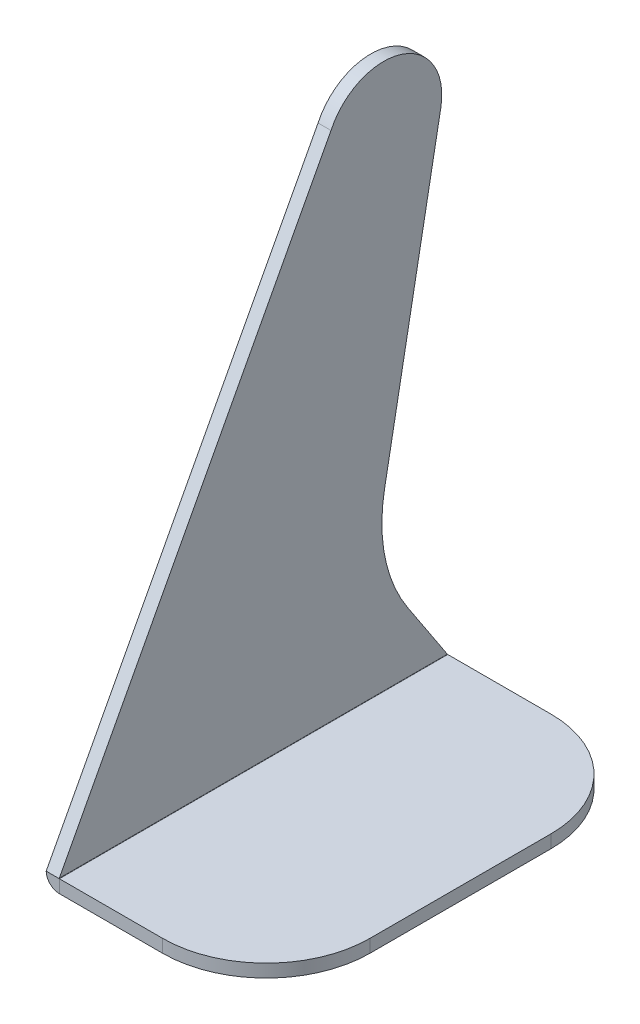
ISO-10303-21;
HEADER;
FILE_DESCRIPTION(('STEP AP214'),'2;1');
FILE_NAME('part.step','',(''),(''),'','','');
FILE_SCHEMA(('AUTOMOTIVE_DESIGN { 1 0 10303 214 1 1 1 1 }'));
ENDSEC;
DATA;
#1=APPLICATION_CONTEXT('core data for automotive mechanical design processes');
#2=APPLICATION_PROTOCOL_DEFINITION('international standard','automotive_design',2000,#1);
#3=PRODUCT_CONTEXT('',#1,'mechanical');
#4=PRODUCT('Part','Part','',(#3));
#5=PRODUCT_RELATED_PRODUCT_CATEGORY('part','',(#4));
#6=PRODUCT_DEFINITION_FORMATION('','',#4);
#7=PRODUCT_DEFINITION_CONTEXT('part definition',#1,'design');
#8=PRODUCT_DEFINITION('design','',#6,#7);
#9=PRODUCT_DEFINITION_SHAPE('','',#8);
#10=(LENGTH_UNIT() NAMED_UNIT(*) SI_UNIT(.MILLI.,.METRE.));
#11=(NAMED_UNIT(*) PLANE_ANGLE_UNIT() SI_UNIT($,.RADIAN.));
#12=(NAMED_UNIT(*) SI_UNIT($,.STERADIAN.) SOLID_ANGLE_UNIT());
#13=UNCERTAINTY_MEASURE_WITH_UNIT(LENGTH_MEASURE(1.E-05),#10,'distance_accuracy_value','');
#14=(GEOMETRIC_REPRESENTATION_CONTEXT(3) GLOBAL_UNCERTAINTY_ASSIGNED_CONTEXT((#13)) GLOBAL_UNIT_ASSIGNED_CONTEXT((#10,
#11,#12)) REPRESENTATION_CONTEXT('',''));
#15=CARTESIAN_POINT('',(0.,0.,0.));
#16=DIRECTION('',(0.,0.,1.));
#17=DIRECTION('',(1.,0.,0.));
#18=AXIS2_PLACEMENT_3D('',#15,#16,#17);
#19=CARTESIAN_POINT('',(-112.412131591498,-100.,-150.));
#20=DIRECTION('',(0.,0.,-1.));
#21=DIRECTION('',(1.,0.,0.));
#22=AXIS2_PLACEMENT_3D('',#19,#20,#21);
#23=PLANE('',#22);
#24=DIRECTION('',(0.,-1.,0.));
#25=VECTOR('',#24,1.);
#26=CARTESIAN_POINT('',(-112.412131591498,-100.,-150.));
#27=LINE('',#26,#25);
#28=CARTESIAN_POINT('',(-112.412131591498,-100.,-150.));
#29=VERTEX_POINT('',#28);
#30=CARTESIAN_POINT('',(-112.412131591498,-105.,-150.));
#31=VERTEX_POINT('',#30);
#32=EDGE_CURVE('E240',#29,#31,#27,.T.);
#33=ORIENTED_EDGE('',*,*,#32,.T.);
#34=CARTESIAN_POINT('',(-112.412131591498,-99.9,-150.));
#35=DIRECTION('',(0.,0.,1.));
#36=DIRECTION('',(1.,0.,0.));
#37=AXIS2_PLACEMENT_3D('',#34,#35,#36);
#38=CIRCLE('',#37,5.1);
#39=CARTESIAN_POINT('',(-117.511151105091,-100.,-150.));
#40=VERTEX_POINT('',#39);
#41=EDGE_CURVE('E210',#40,#31,#38,.T.);
#42=ORIENTED_EDGE('',*,*,#41,.F.);
#43=DIRECTION('',(1.,0.,0.));
#44=VECTOR('',#43,1.);
#45=CARTESIAN_POINT('',(-117.512131591498,-100.,-150.));
#46=LINE('',#45,#44);
#47=EDGE_CURVE('E175',#40,#29,#46,.T.);
#48=ORIENTED_EDGE('',*,*,#47,.T.);
#49=EDGE_LOOP('',(#33,#42,#48));
#50=FACE_BOUND('',#49,.T.);
#51=ADVANCED_FACE('F47',(#50),#23,.T.);
#52=CARTESIAN_POINT('',(-112.412131591498,-99.9,-150.));
#53=DIRECTION('',(0.,0.,1.));
#54=DIRECTION('',(-1.,0.,0.));
#55=AXIS2_PLACEMENT_3D('',#52,#53,#54);
#56=CYLINDRICAL_SURFACE('',#55,0.1);
#57=DIRECTION('',(0.,0.,1.));
#58=VECTOR('',#57,1.);
#59=CARTESIAN_POINT('',(-112.512131591498,-99.9,-150.));
#60=LINE('',#59,#58);
#61=CARTESIAN_POINT('',(-112.512131591498,-99.9,-149.934029584814));
#62=VERTEX_POINT('',#61);
#63=CARTESIAN_POINT('',(-112.512131591498,-99.8999999999999,-0.0531020431389362));
#64=VERTEX_POINT('',#63);
#65=EDGE_CURVE('E225',#62,#64,#60,.T.);
#66=ORIENTED_EDGE('',*,*,#65,.T.);
#67=CARTESIAN_POINT('',(-112.412131591498,-99.9,-0.0531020431389084));
#68=DIRECTION('',(0.,0.468997091214095,0.883199710389852));
#69=DIRECTION('',(0.,-0.883199710389852,0.468997091214095));
#70=AXIS2_PLACEMENT_3D('',#67,#68,#69);
#71=ELLIPSE('',#70,0.113224674808667,0.1);
#72=CARTESIAN_POINT('',(-112.412131591498,-100.,0.));
#73=VERTEX_POINT('',#72);
#74=EDGE_CURVE('E188',#64,#73,#71,.T.);
#75=ORIENTED_EDGE('',*,*,#74,.T.);
#76=DIRECTION('',(0.,0.,1.));
#77=VECTOR('',#76,1.);
#78=CARTESIAN_POINT('',(-112.412131591498,-100.,-150.));
#79=LINE('',#78,#77);
#80=EDGE_CURVE('E228',#29,#73,#79,.T.);
#81=ORIENTED_EDGE('',*,*,#80,.F.);
#82=CARTESIAN_POINT('',(-112.412131591498,-99.9,-149.934029584814));
#83=DIRECTION('',(0.,-0.550670177109292,0.834722921718591));
#84=DIRECTION('',(0.,0.834722921718591,0.550670177109292));
#85=AXIS2_PLACEMENT_3D('',#82,#83,#84);
#86=ELLIPSE('',#85,0.11980023238623,0.1);
#87=EDGE_CURVE('E193',#62,#29,#86,.T.);
#88=ORIENTED_EDGE('',*,*,#87,.F.);
#89=EDGE_LOOP('',(#66,#75,#81,#88));
#90=FACE_BOUND('',#89,.T.);
#91=ADVANCED_FACE('F295',(#90),#56,.F.);
#92=CARTESIAN_POINT('',(-112.512131591498,120.,-150.));
#93=DIRECTION('',(1.,0.,0.));
#94=DIRECTION('',(0.,1.,0.));
#95=AXIS2_PLACEMENT_3D('',#92,#93,#94);
#96=PLANE('',#95);
#97=CARTESIAN_POINT('',(-112.512131591498,-43.5585141976306,-184.645456910847));
#98=DIRECTION('',(-1.,0.,0.));
#99=DIRECTION('',(0.,1.,0.));
#100=AXIS2_PLACEMENT_3D('',#97,#98,#99);
#101=CIRCLE('',#100,60.);
#102=CARTESIAN_POINT('',(-112.512131591498,-32.5634384525264,-125.661490366036));
#103=VERTEX_POINT('',#102);
#104=CARTESIAN_POINT('',(-112.512131591498,-76.5987248241883,-134.562081607732));
#105=VERTEX_POINT('',#104);
#106=EDGE_CURVE('E200',#103,#105,#101,.F.);
#107=ORIENTED_EDGE('',*,*,#106,.F.);
#108=DIRECTION('',(0.,-0.983066109080189,0.183251262418403));
#109=VECTOR('',#108,1.);
#110=CARTESIAN_POINT('',(-112.512131591498,119.261299734068,-153.962816881166));
#111=LINE('',#110,#109);
#112=CARTESIAN_POINT('',(-112.512131591498,84.103368534676,-147.409101706978));
#113=VERTEX_POINT('',#112);
#114=EDGE_CURVE('E147',#113,#103,#111,.T.);
#115=ORIENTED_EDGE('',*,*,#114,.F.);
#116=CARTESIAN_POINT('',(-112.512131591498,88.2178823530275,-125.336462005712));
#117=DIRECTION('',(-1.,0.,0.));
#118=DIRECTION('',(0.,1.,0.));
#119=AXIS2_PLACEMENT_3D('',#116,#117,#118);
#120=CIRCLE('',#119,22.4528538797034);
#121=CARTESIAN_POINT('',(-112.512131591498,97.72053997555,-104.993646432335));
#122=VERTEX_POINT('',#121);
#123=EDGE_CURVE('E197',#122,#113,#120,.T.);
#124=ORIENTED_EDGE('',*,*,#123,.F.);
#125=DIRECTION('',(0.,-0.883199710389852,0.468997091214095));
#126=VECTOR('',#125,1.);
#127=CARTESIAN_POINT('',(-112.512131591498,133.741894525294,-124.121721664566));
#128=LINE('',#127,#126);
#129=EDGE_CURVE('E186',#122,#64,#128,.T.);
#130=ORIENTED_EDGE('',*,*,#129,.T.);
#131=ORIENTED_EDGE('',*,*,#65,.F.);
#132=DIRECTION('',(0.,-0.834722921718591,-0.550670177109292));
#133=VECTOR('',#132,1.);
#134=CARTESIAN_POINT('',(-112.512131591498,53.2877183293326,-48.8754557892083));
#135=LINE('',#134,#133);
#136=EDGE_CURVE('E191',#105,#62,#135,.T.);
#137=ORIENTED_EDGE('',*,*,#136,.F.);
#138=EDGE_LOOP('',(#107,#115,#124,#130,#131,#137));
#139=FACE_BOUND('',#138,.T.);
#140=ADVANCED_FACE('F302',(#139),#96,.T.);
#141=CARTESIAN_POINT('',(-117.512131591498,120.,-150.));
#142=DIRECTION('',(1.,0.,0.));
#143=DIRECTION('',(0.,1.,0.));
#144=AXIS2_PLACEMENT_3D('',#141,#142,#143);
#145=PLANE('',#144);
#146=DIRECTION('',(0.,-0.834722921718591,-0.550670177109292));
#147=VECTOR('',#146,1.);
#148=CARTESIAN_POINT('',(-117.512131591498,38.6247884752364,-58.5486514923669));
#149=LINE('',#148,#147);
#150=CARTESIAN_POINT('',(-117.512131591498,-76.5987248241883,-134.562081607732));
#151=VERTEX_POINT('',#150);
#152=CARTESIAN_POINT('',(-117.512131591498,-99.9,-149.934029584814));
#153=VERTEX_POINT('',#152);
#154=EDGE_CURVE('E152',#151,#153,#149,.T.);
#155=ORIENTED_EDGE('',*,*,#154,.T.);
#156=DIRECTION('',(0.,0.,1.));
#157=VECTOR('',#156,1.);
#158=CARTESIAN_POINT('',(-117.512131591498,-99.8999999999993,-150.));
#159=LINE('',#158,#157);
#160=CARTESIAN_POINT('',(-117.512131591498,-99.9,-0.053102043138905));
#161=VERTEX_POINT('',#160);
#162=EDGE_CURVE('E222',#153,#161,#159,.T.);
#163=ORIENTED_EDGE('',*,*,#162,.T.);
#164=DIRECTION('',(0.,-0.883199710389852,0.468997091214095));
#165=VECTOR('',#164,1.);
#166=CARTESIAN_POINT('',(-117.512131591498,-21.9958271567282,-41.4218095133971));
#167=LINE('',#166,#165);
#168=CARTESIAN_POINT('',(-117.512131591498,97.72053997555,-104.993646432335));
#169=VERTEX_POINT('',#168);
#170=EDGE_CURVE('E167',#169,#161,#167,.T.);
#171=ORIENTED_EDGE('',*,*,#170,.F.);
#172=CARTESIAN_POINT('',(-117.512131591498,88.2178823530275,-125.336462005712));
#173=DIRECTION('',(-1.,0.,0.));
#174=DIRECTION('',(0.,0.,1.));
#175=AXIS2_PLACEMENT_3D('',#172,#173,#174);
#176=CIRCLE('',#175,22.4528538797034);
#177=CARTESIAN_POINT('',(-117.512131591498,84.103368534676,-147.409101706978));
#178=VERTEX_POINT('',#177);
#179=EDGE_CURVE('E165',#169,#178,#176,.T.);
#180=ORIENTED_EDGE('',*,*,#179,.T.);
#181=DIRECTION('',(0.,-0.983066109080189,0.183251262418403));
#182=VECTOR('',#181,1.);
#183=CARTESIAN_POINT('',(-117.512131591498,-23.7311930740334,-127.307890440912));
#184=LINE('',#183,#182);
#185=CARTESIAN_POINT('',(-117.512131591498,-32.5634384525264,-125.661490366036));
#186=VERTEX_POINT('',#185);
#187=EDGE_CURVE('E144',#178,#186,#184,.T.);
#188=ORIENTED_EDGE('',*,*,#187,.T.);
#189=CARTESIAN_POINT('',(-117.512131591498,-43.5585141976306,-184.645456910847));
#190=DIRECTION('',(-1.,0.,0.));
#191=DIRECTION('',(0.,0.,1.));
#192=AXIS2_PLACEMENT_3D('',#189,#190,#191);
#193=CIRCLE('',#192,60.);
#194=EDGE_CURVE('E155',#186,#151,#193,.F.);
#195=ORIENTED_EDGE('',*,*,#194,.T.);
#196=EDGE_LOOP('',(#155,#163,#171,#180,#188,#195));
#197=FACE_BOUND('',#196,.T.);
#198=ADVANCED_FACE('F162',(#197),#145,.F.);
#199=CARTESIAN_POINT('',(-112.412131591498,-99.9,-150.));
#200=DIRECTION('',(0.,0.,1.));
#201=DIRECTION('',(-1.,0.,0.));
#202=AXIS2_PLACEMENT_3D('',#199,#200,#201);
#203=CYLINDRICAL_SURFACE('',#202,5.1);
#204=CARTESIAN_POINT('',(-112.412131591498,-99.9,-149.934029584814));
#205=DIRECTION('',(0.,-0.550670177109292,0.834722921718591));
#206=DIRECTION('',(0.,0.834722921718591,0.550670177109292));
#207=AXIS2_PLACEMENT_3D('',#204,#205,#206);
#208=ELLIPSE('',#207,6.10981185169773,5.1);
#209=EDGE_CURVE('E243',#153,#40,#208,.T.);
#210=ORIENTED_EDGE('',*,*,#209,.T.);
#211=ORIENTED_EDGE('',*,*,#41,.T.);
#212=DIRECTION('',(0.,0.,1.));
#213=VECTOR('',#212,1.);
#214=CARTESIAN_POINT('',(-112.412131591498,-105.,-150.));
#215=LINE('',#214,#213);
#216=CARTESIAN_POINT('',(-112.412131591498,-105.,0.));
#217=VERTEX_POINT('',#216);
#218=EDGE_CURVE('E213',#31,#217,#215,.T.);
#219=ORIENTED_EDGE('',*,*,#218,.T.);
#220=CARTESIAN_POINT('',(-112.412131591498,-99.9,0.));
#221=DIRECTION('',(0.,0.,1.));
#222=DIRECTION('',(1.,0.,0.));
#223=AXIS2_PLACEMENT_3D('',#220,#221,#222);
#224=CIRCLE('',#223,5.1);
#225=CARTESIAN_POINT('',(-117.511151105091,-99.9999999999999,0.));
#226=VERTEX_POINT('',#225);
#227=EDGE_CURVE('E207',#226,#217,#224,.T.);
#228=ORIENTED_EDGE('',*,*,#227,.F.);
#229=CARTESIAN_POINT('',(-112.412131591498,-99.9,-0.0531020431389084));
#230=DIRECTION('',(0.,0.468997091214095,0.883199710389852));
#231=DIRECTION('',(0.,-0.883199710389852,0.468997091214095));
#232=AXIS2_PLACEMENT_3D('',#229,#230,#231);
#233=ELLIPSE('',#232,5.77445841524203,5.1);
#234=EDGE_CURVE('E174',#161,#226,#233,.T.);
#235=ORIENTED_EDGE('',*,*,#234,.F.);
#236=ORIENTED_EDGE('',*,*,#162,.F.);
#237=EDGE_LOOP('',(#210,#211,#219,#228,#235,#236));
#238=FACE_BOUND('',#237,.T.);
#239=ADVANCED_FACE('F273',(#238),#203,.T.);
#240=CARTESIAN_POINT('',(-117.512131591498,-99.8999999999993,-150.));
#241=DIRECTION('',(0.,0.,-1.));
#242=DIRECTION('',(1.,0.,0.));
#243=AXIS2_PLACEMENT_3D('',#240,#241,#242);
#244=PLANE('',#243);
#245=DIRECTION('',(1.,0.,0.));
#246=VECTOR('',#245,1.);
#247=CARTESIAN_POINT('',(-112.512131591498,-105.,-150.));
#248=LINE('',#247,#246);
#249=CARTESIAN_POINT('',(-72.5121315914981,-105.,-150.));
#250=VERTEX_POINT('',#249);
#251=EDGE_CURVE('E203',#31,#250,#248,.T.);
#252=ORIENTED_EDGE('',*,*,#251,.F.);
#253=ORIENTED_EDGE('',*,*,#32,.F.);
#254=DIRECTION('',(1.,0.,0.));
#255=VECTOR('',#254,1.);
#256=CARTESIAN_POINT('',(-112.512131591498,-100.,-150.));
#257=LINE('',#256,#255);
#258=CARTESIAN_POINT('',(-72.5121315914981,-100.,-150.));
#259=VERTEX_POINT('',#258);
#260=EDGE_CURVE('E206',#29,#259,#257,.T.);
#261=ORIENTED_EDGE('',*,*,#260,.T.);
#262=DIRECTION('',(0.,-1.,0.));
#263=VECTOR('',#262,1.);
#264=CARTESIAN_POINT('',(-72.5121315914981,-99.8999999999993,-150.));
#265=LINE('',#264,#263);
#266=EDGE_CURVE('E11',#250,#259,#265,.F.);
#267=ORIENTED_EDGE('',*,*,#266,.F.);
#268=EDGE_LOOP('',(#252,#253,#261,#267));
#269=FACE_BOUND('',#268,.T.);
#270=ADVANCED_FACE('F287',(#269),#244,.T.);
#271=CARTESIAN_POINT('',(-112.512131591498,-99.9,0.));
#272=DIRECTION('',(0.,0.,1.));
#273=DIRECTION('',(-1.,0.,0.));
#274=AXIS2_PLACEMENT_3D('',#271,#272,#273);
#275=PLANE('',#274);
#276=DIRECTION('',(1.,0.,0.));
#277=VECTOR('',#276,1.);
#278=CARTESIAN_POINT('',(-117.512131591498,-100.,0.));
#279=LINE('',#278,#277);
#280=EDGE_CURVE('E178',#226,#73,#279,.T.);
#281=ORIENTED_EDGE('',*,*,#280,.F.);
#282=ORIENTED_EDGE('',*,*,#227,.T.);
#283=DIRECTION('',(0.,1.,0.));
#284=VECTOR('',#283,1.);
#285=CARTESIAN_POINT('',(-112.412131591498,-105.,0.));
#286=LINE('',#285,#284);
#287=EDGE_CURVE('E237',#217,#73,#286,.T.);
#288=ORIENTED_EDGE('',*,*,#287,.T.);
#289=EDGE_LOOP('',(#281,#282,#288));
#290=FACE_BOUND('',#289,.T.);
#291=ADVANCED_FACE('F265',(#290),#275,.T.);
#292=CARTESIAN_POINT('',(-112.512131591498,-105.,-150.));
#293=DIRECTION('',(0.,1.,0.));
#294=DIRECTION('',(0.,0.,-1.));
#295=AXIS2_PLACEMENT_3D('',#292,#293,#294);
#296=PLANE('',#295);
#297=DIRECTION('',(1.,0.,0.));
#298=VECTOR('',#297,1.);
#299=CARTESIAN_POINT('',(-112.512131591498,-105.,0.));
#300=LINE('',#299,#298);
#301=CARTESIAN_POINT('',(-72.5121315914981,-105.,0.));
#302=VERTEX_POINT('',#301);
#303=EDGE_CURVE('E202',#217,#302,#300,.T.);
#304=ORIENTED_EDGE('',*,*,#303,.F.);
#305=ORIENTED_EDGE('',*,*,#218,.F.);
#306=ORIENTED_EDGE('',*,*,#251,.T.);
#307=CARTESIAN_POINT('',(-72.5121315914981,-105.,-110.));
#308=DIRECTION('',(0.,-1.,0.));
#309=DIRECTION('',(0.,0.,-1.));
#310=AXIS2_PLACEMENT_3D('',#307,#308,#309);
#311=CIRCLE('',#310,40.);
#312=CARTESIAN_POINT('',(-32.5121315914981,-105.,-110.));
#313=VERTEX_POINT('',#312);
#314=EDGE_CURVE('E247',#313,#250,#311,.F.);
#315=ORIENTED_EDGE('',*,*,#314,.F.);
#316=DIRECTION('',(0.,0.,1.));
#317=VECTOR('',#316,1.);
#318=CARTESIAN_POINT('',(-32.5121315914981,-105.,-150.));
#319=LINE('',#318,#317);
#320=CARTESIAN_POINT('',(-32.5121315914981,-105.,-40.));
#321=VERTEX_POINT('',#320);
#322=EDGE_CURVE('E234',#313,#321,#319,.T.);
#323=ORIENTED_EDGE('',*,*,#322,.T.);
#324=CARTESIAN_POINT('',(-72.5121315914981,-105.,-40.));
#325=DIRECTION('',(0.,-1.,0.));
#326=DIRECTION('',(0.,0.,-1.));
#327=AXIS2_PLACEMENT_3D('',#324,#325,#326);
#328=CIRCLE('',#327,40.);
#329=EDGE_CURVE('E249',#302,#321,#328,.F.);
#330=ORIENTED_EDGE('',*,*,#329,.F.);
#331=EDGE_LOOP('',(#304,#305,#306,#315,#323,#330));
#332=FACE_BOUND('',#331,.T.);
#333=ADVANCED_FACE('F277',(#332),#296,.F.);
#334=CARTESIAN_POINT('',(-32.5121315914981,-100.,-150.));
#335=DIRECTION('',(1.,0.,0.));
#336=DIRECTION('',(0.,0.,1.));
#337=AXIS2_PLACEMENT_3D('',#334,#335,#336);
#338=PLANE('',#337);
#339=ORIENTED_EDGE('',*,*,#322,.F.);
#340=DIRECTION('',(0.,-1.,0.));
#341=VECTOR('',#340,1.);
#342=CARTESIAN_POINT('',(-32.5121315914981,-100.,-110.));
#343=LINE('',#342,#341);
#344=CARTESIAN_POINT('',(-32.5121315914981,-100.,-110.));
#345=VERTEX_POINT('',#344);
#346=EDGE_CURVE('E252',#345,#313,#343,.T.);
#347=ORIENTED_EDGE('',*,*,#346,.F.);
#348=DIRECTION('',(0.,0.,1.));
#349=VECTOR('',#348,1.);
#350=CARTESIAN_POINT('',(-32.5121315914981,-100.,-150.));
#351=LINE('',#350,#349);
#352=CARTESIAN_POINT('',(-32.5121315914981,-100.,-40.));
#353=VERTEX_POINT('',#352);
#354=EDGE_CURVE('E231',#345,#353,#351,.T.);
#355=ORIENTED_EDGE('',*,*,#354,.T.);
#356=DIRECTION('',(0.,-1.,0.));
#357=VECTOR('',#356,1.);
#358=CARTESIAN_POINT('',(-32.5121315914981,-100.,-40.));
#359=LINE('',#358,#357);
#360=EDGE_CURVE('E254',#321,#353,#359,.F.);
#361=ORIENTED_EDGE('',*,*,#360,.F.);
#362=EDGE_LOOP('',(#339,#347,#355,#361));
#363=FACE_BOUND('',#362,.T.);
#364=ADVANCED_FACE('F282',(#363),#338,.T.);
#365=CARTESIAN_POINT('',(-112.512131591498,-100.,-150.));
#366=DIRECTION('',(0.,1.,0.));
#367=DIRECTION('',(0.,0.,-1.));
#368=AXIS2_PLACEMENT_3D('',#365,#366,#367);
#369=PLANE('',#368);
#370=ORIENTED_EDGE('',*,*,#354,.F.);
#371=CARTESIAN_POINT('',(-72.5121315914981,-100.,-110.));
#372=DIRECTION('',(0.,-1.,0.));
#373=DIRECTION('',(0.,0.,-1.));
#374=AXIS2_PLACEMENT_3D('',#371,#372,#373);
#375=CIRCLE('',#374,40.);
#376=EDGE_CURVE('E62',#259,#345,#375,.T.);
#377=ORIENTED_EDGE('',*,*,#376,.F.);
#378=ORIENTED_EDGE('',*,*,#260,.F.);
#379=ORIENTED_EDGE('',*,*,#80,.T.);
#380=DIRECTION('',(1.,0.,0.));
#381=VECTOR('',#380,1.);
#382=CARTESIAN_POINT('',(-112.512131591498,-100.,0.));
#383=LINE('',#382,#381);
#384=CARTESIAN_POINT('',(-72.5121315914981,-100.,0.));
#385=VERTEX_POINT('',#384);
#386=EDGE_CURVE('E216',#73,#385,#383,.T.);
#387=ORIENTED_EDGE('',*,*,#386,.T.);
#388=CARTESIAN_POINT('',(-72.5121315914981,-100.,-40.));
#389=DIRECTION('',(0.,-1.,0.));
#390=DIRECTION('',(0.,0.,-1.));
#391=AXIS2_PLACEMENT_3D('',#388,#389,#390);
#392=CIRCLE('',#391,40.);
#393=EDGE_CURVE('E55',#353,#385,#392,.T.);
#394=ORIENTED_EDGE('',*,*,#393,.F.);
#395=EDGE_LOOP('',(#370,#377,#378,#379,#387,#394));
#396=FACE_BOUND('',#395,.T.);
#397=ADVANCED_FACE('F259',(#396),#369,.T.);
#398=CARTESIAN_POINT('',(-112.412131591498,-99.9,0.));
#399=DIRECTION('',(0.,0.,-1.));
#400=DIRECTION('',(1.,0.,0.));
#401=AXIS2_PLACEMENT_3D('',#398,#399,#400);
#402=PLANE('',#401);
#403=ORIENTED_EDGE('',*,*,#386,.F.);
#404=ORIENTED_EDGE('',*,*,#287,.F.);
#405=ORIENTED_EDGE('',*,*,#303,.T.);
#406=DIRECTION('',(0.,-1.,0.));
#407=VECTOR('',#406,1.);
#408=CARTESIAN_POINT('',(-72.5121315914981,-105.,0.));
#409=LINE('',#408,#407);
#410=EDGE_CURVE('E245',#385,#302,#409,.T.);
#411=ORIENTED_EDGE('',*,*,#410,.F.);
#412=EDGE_LOOP('',(#403,#404,#405,#411));
#413=FACE_BOUND('',#412,.T.);
#414=ADVANCED_FACE('F263',(#413),#402,.F.);
#415=CARTESIAN_POINT('',(-117.512131591498,38.6247884752364,-58.5486514923669));
#416=DIRECTION('',(0.,0.550670177109292,-0.834722921718591));
#417=DIRECTION('',(0.,-0.834722921718591,-0.550670177109292));
#418=AXIS2_PLACEMENT_3D('',#415,#416,#417);
#419=PLANE('',#418);
#420=ORIENTED_EDGE('',*,*,#136,.T.);
#421=ORIENTED_EDGE('',*,*,#87,.T.);
#422=ORIENTED_EDGE('',*,*,#47,.F.);
#423=ORIENTED_EDGE('',*,*,#209,.F.);
#424=ORIENTED_EDGE('',*,*,#154,.F.);
#425=DIRECTION('',(1.,0.,0.));
#426=VECTOR('',#425,1.);
#427=CARTESIAN_POINT('',(-117.512131591498,-76.5987248241883,-134.562081607732));
#428=LINE('',#427,#426);
#429=EDGE_CURVE('E157',#151,#105,#428,.T.);
#430=ORIENTED_EDGE('',*,*,#429,.T.);
#431=EDGE_LOOP('',(#420,#421,#422,#423,#424,#430));
#432=FACE_BOUND('',#431,.T.);
#433=ADVANCED_FACE('F291',(#432),#419,.T.);
#434=CARTESIAN_POINT('',(-117.512131591498,-21.9958271567282,-41.4218095133971));
#435=DIRECTION('',(0.,-0.468997091214095,-0.883199710389852));
#436=DIRECTION('',(0.,-0.883199710389852,0.468997091214095));
#437=AXIS2_PLACEMENT_3D('',#434,#435,#436);
#438=PLANE('',#437);
#439=ORIENTED_EDGE('',*,*,#74,.F.);
#440=ORIENTED_EDGE('',*,*,#129,.F.);
#441=DIRECTION('',(1.,0.,0.));
#442=VECTOR('',#441,1.);
#443=CARTESIAN_POINT('',(-117.512131591498,97.72053997555,-104.993646432335));
#444=LINE('',#443,#442);
#445=EDGE_CURVE('E181',#169,#122,#444,.T.);
#446=ORIENTED_EDGE('',*,*,#445,.F.);
#447=ORIENTED_EDGE('',*,*,#170,.T.);
#448=ORIENTED_EDGE('',*,*,#234,.T.);
#449=ORIENTED_EDGE('',*,*,#280,.T.);
#450=EDGE_LOOP('',(#439,#440,#446,#447,#448,#449));
#451=FACE_BOUND('',#450,.T.);
#452=ADVANCED_FACE('F269',(#451),#438,.F.);
#453=CARTESIAN_POINT('',(-117.512131591498,-43.5585141976306,-184.645456910847));
#454=DIRECTION('',(1.,0.,0.));
#455=DIRECTION('',(0.,0.,1.));
#456=AXIS2_PLACEMENT_3D('',#453,#454,#455);
#457=CYLINDRICAL_SURFACE('',#456,60.);
#458=DIRECTION('',(1.,0.,0.));
#459=VECTOR('',#458,1.);
#460=CARTESIAN_POINT('',(-117.512131591498,-32.5634384525264,-125.661490366036));
#461=LINE('',#460,#459);
#462=EDGE_CURVE('E140',#186,#103,#461,.T.);
#463=ORIENTED_EDGE('',*,*,#462,.T.);
#464=ORIENTED_EDGE('',*,*,#106,.T.);
#465=ORIENTED_EDGE('',*,*,#429,.F.);
#466=ORIENTED_EDGE('',*,*,#194,.F.);
#467=EDGE_LOOP('',(#463,#464,#465,#466));
#468=FACE_BOUND('',#467,.T.);
#469=ADVANCED_FACE('F156',(#468),#457,.F.);
#470=CARTESIAN_POINT('',(-117.512131591498,88.2178823530275,-125.336462005712));
#471=DIRECTION('',(1.,0.,0.));
#472=DIRECTION('',(0.,0.,1.));
#473=AXIS2_PLACEMENT_3D('',#470,#471,#472);
#474=CYLINDRICAL_SURFACE('',#473,22.4528538797034);
#475=ORIENTED_EDGE('',*,*,#445,.T.);
#476=ORIENTED_EDGE('',*,*,#123,.T.);
#477=DIRECTION('',(1.,0.,0.));
#478=VECTOR('',#477,1.);
#479=CARTESIAN_POINT('',(-117.512131591498,84.103368534676,-147.409101706978));
#480=LINE('',#479,#478);
#481=EDGE_CURVE('E151',#178,#113,#480,.T.);
#482=ORIENTED_EDGE('',*,*,#481,.F.);
#483=ORIENTED_EDGE('',*,*,#179,.F.);
#484=EDGE_LOOP('',(#475,#476,#482,#483));
#485=FACE_BOUND('',#484,.T.);
#486=ADVANCED_FACE('F311',(#485),#474,.T.);
#487=CARTESIAN_POINT('',(-117.512131591498,-23.7311930740334,-127.307890440912));
#488=DIRECTION('',(0.,-0.183251262418403,-0.983066109080189));
#489=DIRECTION('',(0.,-0.983066109080189,0.183251262418403));
#490=AXIS2_PLACEMENT_3D('',#487,#488,#489);
#491=PLANE('',#490);
#492=ORIENTED_EDGE('',*,*,#481,.T.);
#493=ORIENTED_EDGE('',*,*,#114,.T.);
#494=ORIENTED_EDGE('',*,*,#462,.F.);
#495=ORIENTED_EDGE('',*,*,#187,.F.);
#496=EDGE_LOOP('',(#492,#493,#494,#495));
#497=FACE_BOUND('',#496,.T.);
#498=ADVANCED_FACE('F142',(#497),#491,.T.);
#499=CARTESIAN_POINT('',(-72.5121315914981,-99.9,-40.));
#500=DIRECTION('',(0.,1.,0.));
#501=DIRECTION('',(0.,0.,-1.));
#502=AXIS2_PLACEMENT_3D('',#499,#500,#501);
#503=CYLINDRICAL_SURFACE('',#502,40.);
#504=ORIENTED_EDGE('',*,*,#393,.T.);
#505=ORIENTED_EDGE('',*,*,#410,.T.);
#506=ORIENTED_EDGE('',*,*,#329,.T.);
#507=ORIENTED_EDGE('',*,*,#360,.T.);
#508=EDGE_LOOP('',(#504,#505,#506,#507));
#509=FACE_BOUND('',#508,.T.);
#510=ADVANCED_FACE('F257',(#509),#503,.T.);
#511=CARTESIAN_POINT('',(-72.5121315914981,-100.,-110.));
#512=DIRECTION('',(0.,-1.,0.));
#513=DIRECTION('',(0.,0.,1.));
#514=AXIS2_PLACEMENT_3D('',#511,#512,#513);
#515=CYLINDRICAL_SURFACE('',#514,40.);
#516=ORIENTED_EDGE('',*,*,#376,.T.);
#517=ORIENTED_EDGE('',*,*,#346,.T.);
#518=ORIENTED_EDGE('',*,*,#314,.T.);
#519=ORIENTED_EDGE('',*,*,#266,.T.);
#520=EDGE_LOOP('',(#516,#517,#518,#519));
#521=FACE_BOUND('',#520,.T.);
#522=ADVANCED_FACE('F49',(#521),#515,.T.);
#523=CLOSED_SHELL('',(#51,#91,#140,#198,#239,#270,#291,#333,#364,#397,#414,#433,#452,#469,#486,
#498,#510,#522));
#524=MANIFOLD_SOLID_BREP('B2',#523);
#525=ADVANCED_BREP_SHAPE_REPRESENTATION('',(#18,#524),#14);
#526=SHAPE_DEFINITION_REPRESENTATION(#9,#525);
ENDSEC;
END-ISO-10303-21;
